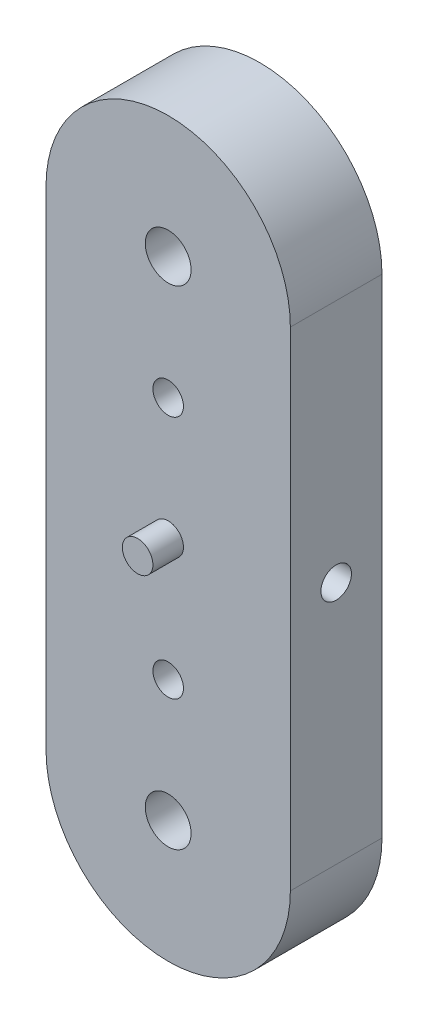
ISO-10303-21;
HEADER;
FILE_DESCRIPTION(('STEP AP214'),'2;1');
FILE_NAME('part.step','',(''),(''),'','','');
FILE_SCHEMA(('AUTOMOTIVE_DESIGN { 1 0 10303 214 1 1 1 1 }'));
ENDSEC;
DATA;
#1=APPLICATION_CONTEXT('core data for automotive mechanical design processes');
#2=APPLICATION_PROTOCOL_DEFINITION('international standard','automotive_design',2000,#1);
#3=PRODUCT_CONTEXT('',#1,'mechanical');
#4=PRODUCT('Part','Part','',(#3));
#5=PRODUCT_RELATED_PRODUCT_CATEGORY('part','',(#4));
#6=PRODUCT_DEFINITION_FORMATION('','',#4);
#7=PRODUCT_DEFINITION_CONTEXT('part definition',#1,'design');
#8=PRODUCT_DEFINITION('design','',#6,#7);
#9=PRODUCT_DEFINITION_SHAPE('','',#8);
#10=(LENGTH_UNIT() NAMED_UNIT(*) SI_UNIT(.MILLI.,.METRE.));
#11=(NAMED_UNIT(*) PLANE_ANGLE_UNIT() SI_UNIT($,.RADIAN.));
#12=(NAMED_UNIT(*) SI_UNIT($,.STERADIAN.) SOLID_ANGLE_UNIT());
#13=UNCERTAINTY_MEASURE_WITH_UNIT(LENGTH_MEASURE(1.E-05),#10,'distance_accuracy_value','');
#14=(GEOMETRIC_REPRESENTATION_CONTEXT(3) GLOBAL_UNCERTAINTY_ASSIGNED_CONTEXT((#13)) GLOBAL_UNIT_ASSIGNED_CONTEXT((#10,
#11,#12)) REPRESENTATION_CONTEXT('',''));
#15=CARTESIAN_POINT('',(0.,0.,0.));
#16=DIRECTION('',(0.,0.,1.));
#17=DIRECTION('',(1.,0.,0.));
#18=AXIS2_PLACEMENT_3D('',#15,#16,#17);
#19=CARTESIAN_POINT('',(50.8,0.,38.1));
#20=DIRECTION('',(0.,0.,-1.));
#21=DIRECTION('',(-1.,0.,0.));
#22=AXIS2_PLACEMENT_3D('',#19,#20,#21);
#23=CYLINDRICAL_SURFACE('',#22,50.8);
#24=CARTESIAN_POINT('',(50.8,0.,0.));
#25=DIRECTION('',(0.,0.,1.));
#26=DIRECTION('',(1.,0.,0.));
#27=AXIS2_PLACEMENT_3D('',#24,#25,#26);
#28=CIRCLE('',#27,50.8);
#29=CARTESIAN_POINT('',(0.,0.,0.));
#30=VERTEX_POINT('',#29);
#31=CARTESIAN_POINT('',(101.6,0.,0.));
#32=VERTEX_POINT('',#31);
#33=EDGE_CURVE('E104',#30,#32,#28,.T.);
#34=ORIENTED_EDGE('',*,*,#33,.T.);
#35=DIRECTION('',(0.,0.,-1.));
#36=VECTOR('',#35,1.);
#37=CARTESIAN_POINT('',(101.6,0.,38.1));
#38=LINE('',#37,#36);
#39=CARTESIAN_POINT('',(101.6,0.,38.1));
#40=VERTEX_POINT('',#39);
#41=EDGE_CURVE('E12',#40,#32,#38,.T.);
#42=ORIENTED_EDGE('',*,*,#41,.F.);
#43=CARTESIAN_POINT('',(50.8,0.,38.1));
#44=DIRECTION('',(0.,0.,1.));
#45=DIRECTION('',(1.,0.,0.));
#46=AXIS2_PLACEMENT_3D('',#43,#44,#45);
#47=CIRCLE('',#46,50.8);
#48=CARTESIAN_POINT('',(0.,0.,38.1));
#49=VERTEX_POINT('',#48);
#50=EDGE_CURVE('E92',#49,#40,#47,.T.);
#51=ORIENTED_EDGE('',*,*,#50,.F.);
#52=DIRECTION('',(0.,0.,-1.));
#53=VECTOR('',#52,1.);
#54=CARTESIAN_POINT('',(0.,0.,38.1));
#55=LINE('',#54,#53);
#56=EDGE_CURVE('E100',#49,#30,#55,.T.);
#57=ORIENTED_EDGE('',*,*,#56,.T.);
#58=EDGE_LOOP('',(#34,#42,#51,#57));
#59=FACE_BOUND('',#58,.T.);
#60=ADVANCED_FACE('F41',(#59),#23,.T.);
#61=CARTESIAN_POINT('',(101.6,203.013094366448,38.1));
#62=DIRECTION('',(-1.,0.,0.));
#63=DIRECTION('',(0.,-1.,0.));
#64=AXIS2_PLACEMENT_3D('',#61,#62,#63);
#65=PLANE('',#64);
#66=CARTESIAN_POINT('',(101.6,101.506547183224,19.05));
#67=DIRECTION('',(1.,0.,0.));
#68=DIRECTION('',(0.,1.,0.));
#69=AXIS2_PLACEMENT_3D('',#66,#67,#68);
#70=CIRCLE('',#69,6.35);
#71=CARTESIAN_POINT('',(101.6,107.856547183224,19.05));
#72=VERTEX_POINT('',#71);
#73=EDGE_CURVE('E118',#72,#72,#70,.T.);
#74=ORIENTED_EDGE('',*,*,#73,.F.);
#75=EDGE_LOOP('',(#74));
#76=FACE_BOUND('',#75,.T.);
#77=DIRECTION('',(0.,1.,0.));
#78=VECTOR('',#77,1.);
#79=CARTESIAN_POINT('',(101.6,203.013094366448,0.));
#80=LINE('',#79,#78);
#81=CARTESIAN_POINT('',(101.6,203.013094366448,0.));
#82=VERTEX_POINT('',#81);
#83=EDGE_CURVE('E96',#32,#82,#80,.T.);
#84=ORIENTED_EDGE('',*,*,#83,.T.);
#85=DIRECTION('',(0.,0.,-1.));
#86=VECTOR('',#85,1.);
#87=CARTESIAN_POINT('',(101.6,203.013094366448,38.1));
#88=LINE('',#87,#86);
#89=CARTESIAN_POINT('',(101.6,203.013094366448,38.1));
#90=VERTEX_POINT('',#89);
#91=EDGE_CURVE('E49',#90,#82,#88,.T.);
#92=ORIENTED_EDGE('',*,*,#91,.F.);
#93=DIRECTION('',(0.,1.,0.));
#94=VECTOR('',#93,1.);
#95=CARTESIAN_POINT('',(101.6,203.013094366448,38.1));
#96=LINE('',#95,#94);
#97=EDGE_CURVE('E87',#40,#90,#96,.T.);
#98=ORIENTED_EDGE('',*,*,#97,.F.);
#99=ORIENTED_EDGE('',*,*,#41,.T.);
#100=EDGE_LOOP('',(#84,#92,#98,#99));
#101=FACE_BOUND('',#100,.T.);
#102=ADVANCED_FACE('F95',(#76,#101),#65,.F.);
#103=CARTESIAN_POINT('',(50.8,203.013094366448,38.1));
#104=DIRECTION('',(0.,0.,-1.));
#105=DIRECTION('',(-1.,0.,0.));
#106=AXIS2_PLACEMENT_3D('',#103,#104,#105);
#107=CYLINDRICAL_SURFACE('',#106,50.8);
#108=CARTESIAN_POINT('',(50.8,203.013094366448,0.));
#109=DIRECTION('',(0.,0.,1.));
#110=DIRECTION('',(-1.,0.,0.));
#111=AXIS2_PLACEMENT_3D('',#108,#109,#110);
#112=CIRCLE('',#111,50.8);
#113=CARTESIAN_POINT('',(0.,203.013094366448,0.));
#114=VERTEX_POINT('',#113);
#115=EDGE_CURVE('E74',#82,#114,#112,.T.);
#116=ORIENTED_EDGE('',*,*,#115,.T.);
#117=DIRECTION('',(0.,0.,-1.));
#118=VECTOR('',#117,1.);
#119=CARTESIAN_POINT('',(0.,203.013094366448,38.1));
#120=LINE('',#119,#118);
#121=CARTESIAN_POINT('',(0.,203.013094366448,38.1));
#122=VERTEX_POINT('',#121);
#123=EDGE_CURVE('E97',#122,#114,#120,.T.);
#124=ORIENTED_EDGE('',*,*,#123,.F.);
#125=CARTESIAN_POINT('',(50.8,203.013094366448,38.1));
#126=DIRECTION('',(0.,0.,1.));
#127=DIRECTION('',(-1.,0.,0.));
#128=AXIS2_PLACEMENT_3D('',#125,#126,#127);
#129=CIRCLE('',#128,50.8);
#130=EDGE_CURVE('E90',#90,#122,#129,.T.);
#131=ORIENTED_EDGE('',*,*,#130,.F.);
#132=ORIENTED_EDGE('',*,*,#91,.T.);
#133=EDGE_LOOP('',(#116,#124,#131,#132));
#134=FACE_BOUND('',#133,.T.);
#135=ADVANCED_FACE('F98',(#134),#107,.T.);
#136=CARTESIAN_POINT('',(0.,0.,38.1));
#137=DIRECTION('',(1.,0.,0.));
#138=DIRECTION('',(0.,0.,-1.));
#139=AXIS2_PLACEMENT_3D('',#136,#137,#138);
#140=PLANE('',#139);
#141=CARTESIAN_POINT('',(0.,101.506547183224,19.05));
#142=DIRECTION('',(1.,0.,0.));
#143=DIRECTION('',(0.,1.,0.));
#144=AXIS2_PLACEMENT_3D('',#141,#142,#143);
#145=CIRCLE('',#144,6.35);
#146=CARTESIAN_POINT('',(0.,107.856547183224,19.05));
#147=VERTEX_POINT('',#146);
#148=EDGE_CURVE('E107',#147,#147,#145,.T.);
#149=ORIENTED_EDGE('',*,*,#148,.T.);
#150=EDGE_LOOP('',(#149));
#151=FACE_BOUND('',#150,.T.);
#152=DIRECTION('',(0.,-1.,0.));
#153=VECTOR('',#152,1.);
#154=CARTESIAN_POINT('',(0.,0.,0.));
#155=LINE('',#154,#153);
#156=EDGE_CURVE('E80',#114,#30,#155,.T.);
#157=ORIENTED_EDGE('',*,*,#156,.T.);
#158=ORIENTED_EDGE('',*,*,#56,.F.);
#159=DIRECTION('',(0.,-1.,0.));
#160=VECTOR('',#159,1.);
#161=CARTESIAN_POINT('',(0.,0.,38.1));
#162=LINE('',#161,#160);
#163=EDGE_CURVE('E57',#122,#49,#162,.T.);
#164=ORIENTED_EDGE('',*,*,#163,.F.);
#165=ORIENTED_EDGE('',*,*,#123,.T.);
#166=EDGE_LOOP('',(#157,#158,#164,#165));
#167=FACE_BOUND('',#166,.T.);
#168=ADVANCED_FACE('F112',(#151,#167),#140,.F.);
#169=CARTESIAN_POINT('',(50.8,0.,38.1));
#170=DIRECTION('',(0.,0.,1.));
#171=DIRECTION('',(1.,0.,0.));
#172=AXIS2_PLACEMENT_3D('',#169,#170,#171);
#173=PLANE('',#172);
#174=CARTESIAN_POINT('',(50.8,101.506547183224,38.1));
#175=DIRECTION('',(0.,0.,1.));
#176=DIRECTION('',(1.,0.,0.));
#177=AXIS2_PLACEMENT_3D('',#174,#175,#176);
#178=CIRCLE('',#177,6.35);
#179=CARTESIAN_POINT('',(57.15,101.506547183224,38.1));
#180=VERTEX_POINT('',#179);
#181=EDGE_CURVE('E148',#180,#180,#178,.T.);
#182=ORIENTED_EDGE('',*,*,#181,.F.);
#183=EDGE_LOOP('',(#182));
#184=FACE_BOUND('',#183,.T.);
#185=CARTESIAN_POINT('',(50.8,50.7065471832238,38.1));
#186=DIRECTION('',(0.,0.,1.));
#187=DIRECTION('',(1.,0.,0.));
#188=AXIS2_PLACEMENT_3D('',#185,#186,#187);
#189=CIRCLE('',#188,6.35);
#190=CARTESIAN_POINT('',(57.15,50.7065471832238,38.1));
#191=VERTEX_POINT('',#190);
#192=EDGE_CURVE('E139',#191,#191,#189,.T.);
#193=ORIENTED_EDGE('',*,*,#192,.F.);
#194=EDGE_LOOP('',(#193));
#195=FACE_BOUND('',#194,.T.);
#196=CARTESIAN_POINT('',(50.8,152.213094366448,38.1));
#197=DIRECTION('',(0.,0.,1.));
#198=DIRECTION('',(1.,0.,0.));
#199=AXIS2_PLACEMENT_3D('',#196,#197,#198);
#200=CIRCLE('',#199,6.35);
#201=CARTESIAN_POINT('',(57.15,152.213094366448,38.1));
#202=VERTEX_POINT('',#201);
#203=EDGE_CURVE('E136',#202,#202,#200,.T.);
#204=ORIENTED_EDGE('',*,*,#203,.F.);
#205=EDGE_LOOP('',(#204));
#206=FACE_BOUND('',#205,.T.);
#207=CARTESIAN_POINT('',(50.8,0.,38.1));
#208=DIRECTION('',(0.,0.,1.));
#209=DIRECTION('',(1.,0.,0.));
#210=AXIS2_PLACEMENT_3D('',#207,#208,#209);
#211=CIRCLE('',#210,9.525);
#212=CARTESIAN_POINT('',(60.325,0.,38.1));
#213=VERTEX_POINT('',#212);
#214=EDGE_CURVE('E129',#213,#213,#211,.T.);
#215=ORIENTED_EDGE('',*,*,#214,.F.);
#216=EDGE_LOOP('',(#215));
#217=FACE_BOUND('',#216,.T.);
#218=CARTESIAN_POINT('',(50.8,203.013094366448,38.1));
#219=DIRECTION('',(0.,0.,1.));
#220=DIRECTION('',(1.,0.,0.));
#221=AXIS2_PLACEMENT_3D('',#218,#219,#220);
#222=CIRCLE('',#221,9.525);
#223=CARTESIAN_POINT('',(60.325,203.013094366448,38.1));
#224=VERTEX_POINT('',#223);
#225=EDGE_CURVE('E121',#224,#224,#222,.T.);
#226=ORIENTED_EDGE('',*,*,#225,.F.);
#227=EDGE_LOOP('',(#226));
#228=FACE_BOUND('',#227,.T.);
#229=ORIENTED_EDGE('',*,*,#50,.T.);
#230=ORIENTED_EDGE('',*,*,#97,.T.);
#231=ORIENTED_EDGE('',*,*,#130,.T.);
#232=ORIENTED_EDGE('',*,*,#163,.T.);
#233=EDGE_LOOP('',(#229,#230,#231,#232));
#234=FACE_BOUND('',#233,.T.);
#235=ADVANCED_FACE('F88',(#184,#195,#206,#217,#228,#234),#173,.T.);
#236=CARTESIAN_POINT('',(50.8,0.,0.));
#237=DIRECTION('',(0.,0.,1.));
#238=DIRECTION('',(1.,0.,0.));
#239=AXIS2_PLACEMENT_3D('',#236,#237,#238);
#240=PLANE('',#239);
#241=CARTESIAN_POINT('',(50.8,0.,0.));
#242=DIRECTION('',(0.,0.,1.));
#243=DIRECTION('',(1.,0.,0.));
#244=AXIS2_PLACEMENT_3D('',#241,#242,#243);
#245=CIRCLE('',#244,9.525);
#246=CARTESIAN_POINT('',(60.325,0.,0.));
#247=VERTEX_POINT('',#246);
#248=EDGE_CURVE('E132',#247,#247,#245,.T.);
#249=ORIENTED_EDGE('',*,*,#248,.T.);
#250=EDGE_LOOP('',(#249));
#251=FACE_BOUND('',#250,.T.);
#252=CARTESIAN_POINT('',(50.8,203.013094366448,0.));
#253=DIRECTION('',(0.,0.,1.));
#254=DIRECTION('',(1.,0.,0.));
#255=AXIS2_PLACEMENT_3D('',#252,#253,#254);
#256=CIRCLE('',#255,9.525);
#257=CARTESIAN_POINT('',(60.325,203.013094366448,0.));
#258=VERTEX_POINT('',#257);
#259=EDGE_CURVE('E126',#258,#258,#256,.T.);
#260=ORIENTED_EDGE('',*,*,#259,.T.);
#261=EDGE_LOOP('',(#260));
#262=FACE_BOUND('',#261,.T.);
#263=ORIENTED_EDGE('',*,*,#33,.F.);
#264=ORIENTED_EDGE('',*,*,#156,.F.);
#265=ORIENTED_EDGE('',*,*,#115,.F.);
#266=ORIENTED_EDGE('',*,*,#83,.F.);
#267=EDGE_LOOP('',(#263,#264,#265,#266));
#268=FACE_BOUND('',#267,.T.);
#269=ADVANCED_FACE('F115',(#251,#262,#268),#240,.F.);
#270=CARTESIAN_POINT('',(0.,101.506547183224,19.05));
#271=DIRECTION('',(1.,0.,0.));
#272=DIRECTION('',(0.,1.,0.));
#273=AXIS2_PLACEMENT_3D('',#270,#271,#272);
#274=CYLINDRICAL_SURFACE('',#273,6.35);
#275=CARTESIAN_POINT('',(0.,107.856547183224,19.05));
#276=CARTESIAN_POINT('',(1.05833333333328,107.856547183224,19.05));
#277=CARTESIAN_POINT('',(2.11666666666661,107.856547183224,19.05));
#278=CARTESIAN_POINT('',(4.23333333333328,107.856547183224,19.05));
#279=CARTESIAN_POINT('',(5.29166666666661,107.856547183224,19.05));
#280=CARTESIAN_POINT('',(7.40833333333328,107.856547183224,19.05));
#281=CARTESIAN_POINT('',(8.46666666666661,107.856547183224,19.05));
#282=CARTESIAN_POINT('',(10.5833333333333,107.856547183224,19.05));
#283=CARTESIAN_POINT('',(11.6416666666666,107.856547183224,19.05));
#284=CARTESIAN_POINT('',(13.7583333333333,107.856547183224,19.05));
#285=CARTESIAN_POINT('',(14.8166666666666,107.856547183224,19.05));
#286=CARTESIAN_POINT('',(16.9333333333333,107.856547183224,19.05));
#287=CARTESIAN_POINT('',(17.9916666666666,107.856547183224,19.05));
#288=CARTESIAN_POINT('',(20.1083333333333,107.856547183224,19.05));
#289=CARTESIAN_POINT('',(21.1666666666666,107.856547183224,19.05));
#290=CARTESIAN_POINT('',(23.2833333333333,107.856547183224,19.05));
#291=CARTESIAN_POINT('',(24.3416666666666,107.856547183224,19.05));
#292=CARTESIAN_POINT('',(26.4583333333333,107.856547183224,19.05));
#293=CARTESIAN_POINT('',(27.5166666666666,107.856547183224,19.05));
#294=CARTESIAN_POINT('',(29.6333333333333,107.856547183224,19.05));
#295=CARTESIAN_POINT('',(30.6916666666666,107.856547183224,19.05));
#296=CARTESIAN_POINT('',(32.8083333333333,107.856547183224,19.05));
#297=CARTESIAN_POINT('',(33.8666666666666,107.856547183224,19.05));
#298=CARTESIAN_POINT('',(35.9833333333333,107.856547183224,19.05));
#299=CARTESIAN_POINT('',(37.0416666666666,107.856547183224,19.05));
#300=CARTESIAN_POINT('',(39.1583333333333,107.856547183224,19.05));
#301=CARTESIAN_POINT('',(40.2166666666666,107.856547183224,19.05));
#302=CARTESIAN_POINT('',(42.3333333333333,107.856547183224,19.05));
#303=CARTESIAN_POINT('',(43.3916666666666,107.856547183224,19.05));
#304=CARTESIAN_POINT('',(45.5083333333333,107.856547183224,19.05));
#305=CARTESIAN_POINT('',(46.5666666666666,107.856547183224,19.05));
#306=CARTESIAN_POINT('',(48.6833333333333,107.856547183224,19.05));
#307=CARTESIAN_POINT('',(49.7416666666666,107.856547183224,19.05));
#308=CARTESIAN_POINT('',(51.8583333333333,107.856547183224,19.05));
#309=CARTESIAN_POINT('',(52.9166666666666,107.856547183224,19.05));
#310=CARTESIAN_POINT('',(55.0333333333333,107.856547183224,19.05));
#311=CARTESIAN_POINT('',(56.0916666666666,107.856547183224,19.05));
#312=CARTESIAN_POINT('',(58.2083333333333,107.856547183224,19.05));
#313=CARTESIAN_POINT('',(59.2666666666666,107.856547183224,19.05));
#314=CARTESIAN_POINT('',(61.3833333333333,107.856547183224,19.05));
#315=CARTESIAN_POINT('',(62.4416666666666,107.856547183224,19.05));
#316=CARTESIAN_POINT('',(64.5583333333333,107.856547183224,19.05));
#317=CARTESIAN_POINT('',(65.6166666666666,107.856547183224,19.05));
#318=CARTESIAN_POINT('',(67.7333333333333,107.856547183224,19.05));
#319=CARTESIAN_POINT('',(68.7916666666666,107.856547183224,19.05));
#320=CARTESIAN_POINT('',(70.9083333333333,107.856547183224,19.05));
#321=CARTESIAN_POINT('',(71.9666666666666,107.856547183224,19.05));
#322=CARTESIAN_POINT('',(74.0833333333333,107.856547183224,19.05));
#323=CARTESIAN_POINT('',(75.1416666666666,107.856547183224,19.05));
#324=CARTESIAN_POINT('',(77.2583333333333,107.856547183224,19.05));
#325=CARTESIAN_POINT('',(78.3166666666666,107.856547183224,19.05));
#326=CARTESIAN_POINT('',(80.4333333333333,107.856547183224,19.05));
#327=CARTESIAN_POINT('',(81.4916666666666,107.856547183224,19.05));
#328=CARTESIAN_POINT('',(83.6083333333333,107.856547183224,19.05));
#329=CARTESIAN_POINT('',(84.6666666666666,107.856547183224,19.05));
#330=CARTESIAN_POINT('',(86.7833333333333,107.856547183224,19.05));
#331=CARTESIAN_POINT('',(87.8416666666666,107.856547183224,19.05));
#332=CARTESIAN_POINT('',(89.9583333333333,107.856547183224,19.05));
#333=CARTESIAN_POINT('',(91.0166666666666,107.856547183224,19.05));
#334=CARTESIAN_POINT('',(93.1333333333333,107.856547183224,19.05));
#335=CARTESIAN_POINT('',(94.1916666666666,107.856547183224,19.05));
#336=CARTESIAN_POINT('',(96.3083333333333,107.856547183224,19.05));
#337=CARTESIAN_POINT('',(97.3666666666666,107.856547183224,19.05));
#338=CARTESIAN_POINT('',(99.4833333333333,107.856547183224,19.05));
#339=CARTESIAN_POINT('',(100.541666666667,107.856547183224,19.05));
#340=CARTESIAN_POINT('',(101.6,107.856547183224,19.05));
#341=B_SPLINE_CURVE_WITH_KNOTS('',3,(#275,#276,#277,#278,#279,#280,#281,#282,#283,#284,#285,
#286,#287,#288,#289,#290,#291,#292,#293,#294,#295,#296,#297,#298,#299,#300,#301,#302,#303,#304,
#305,#306,#307,#308,#309,#310,#311,#312,#313,#314,#315,#316,#317,#318,#319,#320,#321,#322,#323,
#324,#325,#326,#327,#328,#329,#330,#331,#332,#333,#334,#335,#336,#337,#338,#339,#340),
.UNSPECIFIED.,.F.,.F.,(4,2,2,2,2,2,2,2,2,2,2,2,2,2,2,2,2,2,2,2,2,2,2,2,2,2,2,2,2,2,2,2,4),(0.,
3.175,6.35,9.525,12.7,15.875,19.05,22.225,25.4,28.575,31.75,34.925,38.1,41.275,44.45,47.625,
50.8,53.975,57.15,60.325,63.5,66.675,69.85,73.025,76.2,79.375,82.55,85.725,88.9,92.075,95.25,
98.425,101.6),.UNSPECIFIED.);
#342=EDGE_CURVE('BSEAM177',#147,#72,#341,.T.);
#343=ORIENTED_EDGE('',*,*,#148,.F.);
#344=ORIENTED_EDGE('',*,*,#73,.T.);
#345=ORIENTED_EDGE('',*,*,#342,.T.);
#346=ORIENTED_EDGE('',*,*,#342,.F.);
#347=EDGE_LOOP('',(#343,#345,#344,#346));
#348=FACE_BOUND('',#347,.T.);
#349=ADVANCED_FACE('F177',(#348),#274,.F.);
#350=CARTESIAN_POINT('',(50.8,203.013094366448,38.1));
#351=DIRECTION('',(0.,0.,1.));
#352=DIRECTION('',(1.,0.,0.));
#353=AXIS2_PLACEMENT_3D('',#350,#351,#352);
#354=CYLINDRICAL_SURFACE('',#353,9.525);
#355=ORIENTED_EDGE('',*,*,#259,.F.);
#356=EDGE_LOOP('',(#355));
#357=FACE_BOUND('',#356,.T.);
#358=ORIENTED_EDGE('',*,*,#225,.T.);
#359=EDGE_LOOP('',(#358));
#360=FACE_BOUND('',#359,.T.);
#361=ADVANCED_FACE('F174',(#357,#360),#354,.F.);
#362=CARTESIAN_POINT('',(50.8,0.,38.1));
#363=DIRECTION('',(0.,0.,1.));
#364=DIRECTION('',(1.,0.,0.));
#365=AXIS2_PLACEMENT_3D('',#362,#363,#364);
#366=CYLINDRICAL_SURFACE('',#365,9.525);
#367=ORIENTED_EDGE('',*,*,#248,.F.);
#368=EDGE_LOOP('',(#367));
#369=FACE_BOUND('',#368,.T.);
#370=ORIENTED_EDGE('',*,*,#214,.T.);
#371=EDGE_LOOP('',(#370));
#372=FACE_BOUND('',#371,.T.);
#373=ADVANCED_FACE('F176',(#369,#372),#366,.F.);
#374=CARTESIAN_POINT('',(50.8,152.213094366448,-17.9605122421383));
#375=DIRECTION('',(0.,0.,1.));
#376=DIRECTION('',(1.,0.,0.));
#377=AXIS2_PLACEMENT_3D('',#374,#375,#376);
#378=CYLINDRICAL_SURFACE('',#377,6.35);
#379=CARTESIAN_POINT('',(50.8,152.213094366448,2.54));
#380=DIRECTION('',(0.,0.,1.));
#381=DIRECTION('',(1.,0.,0.));
#382=AXIS2_PLACEMENT_3D('',#379,#380,#381);
#383=CIRCLE('',#382,6.35);
#384=CARTESIAN_POINT('',(57.15,152.213094366448,2.54));
#385=VERTEX_POINT('',#384);
#386=EDGE_CURVE('E140',#385,#385,#383,.F.);
#387=ORIENTED_EDGE('',*,*,#386,.T.);
#388=EDGE_LOOP('',(#387));
#389=FACE_BOUND('',#388,.T.);
#390=ORIENTED_EDGE('',*,*,#203,.T.);
#391=EDGE_LOOP('',(#390));
#392=FACE_BOUND('',#391,.T.);
#393=ADVANCED_FACE('F184',(#389,#392),#378,.F.);
#394=CARTESIAN_POINT('',(50.8,0.,2.54));
#395=DIRECTION('',(0.,0.,1.));
#396=DIRECTION('',(1.,0.,0.));
#397=AXIS2_PLACEMENT_3D('',#394,#395,#396);
#398=PLANE('',#397);
#399=ORIENTED_EDGE('',*,*,#386,.F.);
#400=EDGE_LOOP('',(#399));
#401=FACE_BOUND('',#400,.T.);
#402=ADVANCED_FACE('F276',(#401),#398,.T.);
#403=CARTESIAN_POINT('',(50.8,50.7065471832238,-17.9605122421383));
#404=DIRECTION('',(0.,0.,1.));
#405=DIRECTION('',(1.,0.,0.));
#406=AXIS2_PLACEMENT_3D('',#403,#404,#405);
#407=CYLINDRICAL_SURFACE('',#406,6.35);
#408=CARTESIAN_POINT('',(50.8,50.7065471832238,2.54));
#409=DIRECTION('',(0.,0.,1.));
#410=DIRECTION('',(1.,0.,0.));
#411=AXIS2_PLACEMENT_3D('',#408,#409,#410);
#412=CIRCLE('',#411,6.35);
#413=CARTESIAN_POINT('',(57.15,50.7065471832238,2.54));
#414=VERTEX_POINT('',#413);
#415=EDGE_CURVE('E135',#414,#414,#412,.F.);
#416=ORIENTED_EDGE('',*,*,#415,.T.);
#417=EDGE_LOOP('',(#416));
#418=FACE_BOUND('',#417,.T.);
#419=ORIENTED_EDGE('',*,*,#192,.T.);
#420=EDGE_LOOP('',(#419));
#421=FACE_BOUND('',#420,.T.);
#422=ADVANCED_FACE('F286',(#418,#421),#407,.F.);
#423=CARTESIAN_POINT('',(50.8,0.,2.54));
#424=DIRECTION('',(0.,0.,1.));
#425=DIRECTION('',(1.,0.,0.));
#426=AXIS2_PLACEMENT_3D('',#423,#424,#425);
#427=PLANE('',#426);
#428=ORIENTED_EDGE('',*,*,#415,.F.);
#429=EDGE_LOOP('',(#428));
#430=FACE_BOUND('',#429,.T.);
#431=ADVANCED_FACE('F159',(#430),#427,.T.);
#432=CARTESIAN_POINT('',(50.8,101.506547183224,50.8));
#433=DIRECTION('',(0.,0.,-1.));
#434=DIRECTION('',(-1.,0.,0.));
#435=AXIS2_PLACEMENT_3D('',#432,#433,#434);
#436=CYLINDRICAL_SURFACE('',#435,6.35);
#437=CARTESIAN_POINT('',(50.8,101.506547183224,50.8));
#438=DIRECTION('',(0.,0.,1.));
#439=DIRECTION('',(1.,0.,0.));
#440=AXIS2_PLACEMENT_3D('',#437,#438,#439);
#441=CIRCLE('',#440,6.35);
#442=CARTESIAN_POINT('',(57.15,101.506547183224,50.8));
#443=VERTEX_POINT('',#442);
#444=EDGE_CURVE('E143',#443,#443,#441,.T.);
#445=ORIENTED_EDGE('',*,*,#444,.F.);
#446=EDGE_LOOP('',(#445));
#447=FACE_BOUND('',#446,.T.);
#448=ORIENTED_EDGE('',*,*,#181,.T.);
#449=EDGE_LOOP('',(#448));
#450=FACE_BOUND('',#449,.T.);
#451=ADVANCED_FACE('F156',(#447,#450),#436,.T.);
#452=CARTESIAN_POINT('',(50.8,101.506547183224,50.8));
#453=DIRECTION('',(0.,0.,1.));
#454=DIRECTION('',(1.,0.,0.));
#455=AXIS2_PLACEMENT_3D('',#452,#453,#454);
#456=PLANE('',#455);
#457=ORIENTED_EDGE('',*,*,#444,.T.);
#458=EDGE_LOOP('',(#457));
#459=FACE_BOUND('',#458,.T.);
#460=ADVANCED_FACE('F154',(#459),#456,.T.);
#461=CLOSED_SHELL('',(#60,#102,#135,#168,#235,#269,#349,#361,#373,#393,#402,#422,#431,#451,#460));
#462=MANIFOLD_SOLID_BREP('B2',#461);
#463=ADVANCED_BREP_SHAPE_REPRESENTATION('',(#18,#462),#14);
#464=SHAPE_DEFINITION_REPRESENTATION(#9,#463);
ENDSEC;
END-ISO-10303-21;
